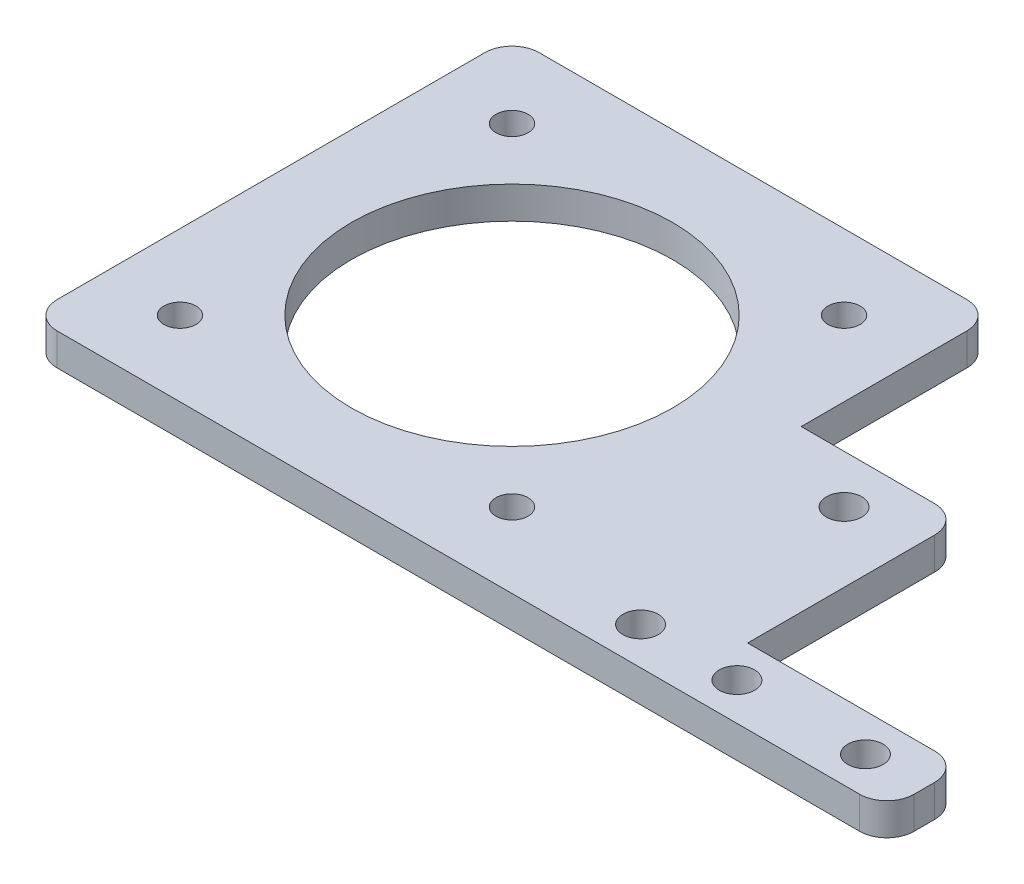
ISO-10303-21;
HEADER;
FILE_DESCRIPTION(('STEP AP214'),'2;1');
FILE_NAME('part.step','',(''),(''),'','','');
FILE_SCHEMA(('AUTOMOTIVE_DESIGN { 1 0 10303 214 1 1 1 1 }'));
ENDSEC;
DATA;
#1=APPLICATION_CONTEXT('core data for automotive mechanical design processes');
#2=APPLICATION_PROTOCOL_DEFINITION('international standard','automotive_design',2000,#1);
#3=PRODUCT_CONTEXT('',#1,'mechanical');
#4=PRODUCT('Part','Part','',(#3));
#5=PRODUCT_RELATED_PRODUCT_CATEGORY('part','',(#4));
#6=PRODUCT_DEFINITION_FORMATION('','',#4);
#7=PRODUCT_DEFINITION_CONTEXT('part definition',#1,'design');
#8=PRODUCT_DEFINITION('design','',#6,#7);
#9=PRODUCT_DEFINITION_SHAPE('','',#8);
#10=(LENGTH_UNIT() NAMED_UNIT(*) SI_UNIT(.MILLI.,.METRE.));
#11=(NAMED_UNIT(*) PLANE_ANGLE_UNIT() SI_UNIT($,.RADIAN.));
#12=(NAMED_UNIT(*) SI_UNIT($,.STERADIAN.) SOLID_ANGLE_UNIT());
#13=UNCERTAINTY_MEASURE_WITH_UNIT(LENGTH_MEASURE(1.E-05),#10,'distance_accuracy_value','');
#14=(GEOMETRIC_REPRESENTATION_CONTEXT(3) GLOBAL_UNCERTAINTY_ASSIGNED_CONTEXT((#13)) GLOBAL_UNIT_ASSIGNED_CONTEXT((#10,
#11,#12)) REPRESENTATION_CONTEXT('',''));
#15=CARTESIAN_POINT('',(0.,0.,0.));
#16=DIRECTION('',(0.,0.,1.));
#17=DIRECTION('',(1.,0.,0.));
#18=AXIS2_PLACEMENT_3D('',#15,#16,#17);
#19=CARTESIAN_POINT('',(0.,3.,0.));
#20=DIRECTION('',(0.,-1.,0.));
#21=DIRECTION('',(0.,0.,-1.));
#22=AXIS2_PLACEMENT_3D('',#19,#20,#21);
#23=PLANE('',#22);
#24=DIRECTION('',(0.,0.,1.));
#25=VECTOR('',#24,1.);
#26=CARTESIAN_POINT('',(-22.5,3.,22.5));
#27=LINE('',#26,#25);
#28=CARTESIAN_POINT('',(-22.5,3.,-19.96));
#29=VERTEX_POINT('',#28);
#30=CARTESIAN_POINT('',(-22.5,3.,19.96));
#31=VERTEX_POINT('',#30);
#32=EDGE_CURVE('E258',#29,#31,#27,.T.);
#33=ORIENTED_EDGE('',*,*,#32,.T.);
#34=CARTESIAN_POINT('',(-19.96,3.,19.96));
#35=DIRECTION('',(0.,-1.,0.));
#36=DIRECTION('',(0.,0.,-1.));
#37=AXIS2_PLACEMENT_3D('',#34,#35,#36);
#38=CIRCLE('',#37,2.54);
#39=CARTESIAN_POINT('',(-19.96,3.,22.5));
#40=VERTEX_POINT('',#39);
#41=EDGE_CURVE('E220',#31,#40,#38,.F.);
#42=ORIENTED_EDGE('',*,*,#41,.T.);
#43=DIRECTION('',(1.,0.,0.));
#44=VECTOR('',#43,1.);
#45=CARTESIAN_POINT('',(-22.5,3.,22.5));
#46=LINE('',#45,#44);
#47=CARTESIAN_POINT('',(54.96,3.,22.5));
#48=VERTEX_POINT('',#47);
#49=EDGE_CURVE('E260',#40,#48,#46,.T.);
#50=ORIENTED_EDGE('',*,*,#49,.T.);
#51=CARTESIAN_POINT('',(54.96,3.,19.96));
#52=DIRECTION('',(0.,-1.,0.));
#53=DIRECTION('',(0.,0.,-1.));
#54=AXIS2_PLACEMENT_3D('',#51,#52,#53);
#55=CIRCLE('',#54,2.54);
#56=CARTESIAN_POINT('',(57.5,3.,19.96));
#57=VERTEX_POINT('',#56);
#58=EDGE_CURVE('E218',#48,#57,#55,.F.);
#59=ORIENTED_EDGE('',*,*,#58,.T.);
#60=DIRECTION('',(0.,0.,-1.));
#61=VECTOR('',#60,1.);
#62=CARTESIAN_POINT('',(57.5,3.,22.5));
#63=LINE('',#62,#61);
#64=CARTESIAN_POINT('',(57.5,3.,18.04));
#65=VERTEX_POINT('',#64);
#66=EDGE_CURVE('E150',#57,#65,#63,.T.);
#67=ORIENTED_EDGE('',*,*,#66,.T.);
#68=CARTESIAN_POINT('',(54.96,3.,18.04));
#69=DIRECTION('',(0.,-1.,0.));
#70=DIRECTION('',(0.,0.,-1.));
#71=AXIS2_PLACEMENT_3D('',#68,#69,#70);
#72=CIRCLE('',#71,2.54);
#73=CARTESIAN_POINT('',(54.96,3.,15.5));
#74=VERTEX_POINT('',#73);
#75=EDGE_CURVE('E146',#65,#74,#72,.F.);
#76=ORIENTED_EDGE('',*,*,#75,.T.);
#77=DIRECTION('',(-1.,0.,0.));
#78=VECTOR('',#77,1.);
#79=CARTESIAN_POINT('',(57.5,3.,15.5));
#80=LINE('',#79,#78);
#81=CARTESIAN_POINT('',(37.5,3.,15.5));
#82=VERTEX_POINT('',#81);
#83=EDGE_CURVE('E139',#74,#82,#80,.T.);
#84=ORIENTED_EDGE('',*,*,#83,.T.);
#85=DIRECTION('',(0.,0.,-1.));
#86=VECTOR('',#85,1.);
#87=CARTESIAN_POINT('',(37.5,3.,15.5));
#88=LINE('',#87,#86);
#89=CARTESIAN_POINT('',(37.5,3.,-1.96000000000001));
#90=VERTEX_POINT('',#89);
#91=EDGE_CURVE('E143',#82,#90,#88,.T.);
#92=ORIENTED_EDGE('',*,*,#91,.T.);
#93=CARTESIAN_POINT('',(34.96,3.,-1.96000000000001));
#94=DIRECTION('',(0.,-1.,0.));
#95=DIRECTION('',(0.,0.,-1.));
#96=AXIS2_PLACEMENT_3D('',#93,#94,#95);
#97=CIRCLE('',#96,2.54);
#98=CARTESIAN_POINT('',(34.96,3.,-4.50000000000001));
#99=VERTEX_POINT('',#98);
#100=EDGE_CURVE('E54',#90,#99,#97,.F.);
#101=ORIENTED_EDGE('',*,*,#100,.T.);
#102=DIRECTION('',(-1.,0.,0.));
#103=VECTOR('',#102,1.);
#104=CARTESIAN_POINT('',(37.5,3.,-4.50000000000001));
#105=LINE('',#104,#103);
#106=CARTESIAN_POINT('',(22.5,3.,-4.50000000000001));
#107=VERTEX_POINT('',#106);
#108=EDGE_CURVE('E162',#99,#107,#105,.T.);
#109=ORIENTED_EDGE('',*,*,#108,.T.);
#110=DIRECTION('',(0.,0.,-1.));
#111=VECTOR('',#110,1.);
#112=CARTESIAN_POINT('',(22.5,3.,-4.50000000000001));
#113=LINE('',#112,#111);
#114=CARTESIAN_POINT('',(22.5,3.,-19.96));
#115=VERTEX_POINT('',#114);
#116=EDGE_CURVE('E188',#107,#115,#113,.T.);
#117=ORIENTED_EDGE('',*,*,#116,.T.);
#118=CARTESIAN_POINT('',(19.96,3.,-19.96));
#119=DIRECTION('',(0.,-1.,0.));
#120=DIRECTION('',(0.,0.,-1.));
#121=AXIS2_PLACEMENT_3D('',#118,#119,#120);
#122=CIRCLE('',#121,2.54);
#123=CARTESIAN_POINT('',(19.96,3.,-22.5));
#124=VERTEX_POINT('',#123);
#125=EDGE_CURVE('E214',#115,#124,#122,.F.);
#126=ORIENTED_EDGE('',*,*,#125,.T.);
#127=DIRECTION('',(-1.,0.,0.));
#128=VECTOR('',#127,1.);
#129=CARTESIAN_POINT('',(-22.5,3.,-22.5));
#130=LINE('',#129,#128);
#131=CARTESIAN_POINT('',(-19.96,3.,-22.5));
#132=VERTEX_POINT('',#131);
#133=EDGE_CURVE('E242',#124,#132,#130,.T.);
#134=ORIENTED_EDGE('',*,*,#133,.T.);
#135=CARTESIAN_POINT('',(-19.96,3.,-19.96));
#136=DIRECTION('',(0.,-1.,0.));
#137=DIRECTION('',(0.,0.,-1.));
#138=AXIS2_PLACEMENT_3D('',#135,#136,#137);
#139=CIRCLE('',#138,2.54);
#140=EDGE_CURVE('E212',#132,#29,#139,.F.);
#141=ORIENTED_EDGE('',*,*,#140,.T.);
#142=EDGE_LOOP('',(#33,#42,#50,#59,#67,#76,#84,#92,#101,#109,#117,#126,#134,#141));
#143=FACE_BOUND('',#142,.T.);
#144=CARTESIAN_POINT('',(0.,3.,0.));
#145=DIRECTION('',(0.,1.,0.));
#146=DIRECTION('',(0.,0.,1.));
#147=AXIS2_PLACEMENT_3D('',#144,#145,#146);
#148=CIRCLE('',#147,15.);
#149=CARTESIAN_POINT('',(0.,3.,15.));
#150=VERTEX_POINT('',#149);
#151=EDGE_CURVE('E171',#150,#150,#148,.T.);
#152=ORIENTED_EDGE('',*,*,#151,.F.);
#153=EDGE_LOOP('',(#152));
#154=FACE_BOUND('',#153,.T.);
#155=CARTESIAN_POINT('',(31.,3.,0.));
#156=DIRECTION('',(0.,1.,0.));
#157=DIRECTION('',(0.,0.,1.));
#158=AXIS2_PLACEMENT_3D('',#155,#156,#157);
#159=CIRCLE('',#158,1.65);
#160=CARTESIAN_POINT('',(31.,3.,1.65));
#161=VERTEX_POINT('',#160);
#162=EDGE_CURVE('E291',#161,#161,#159,.T.);
#163=ORIENTED_EDGE('',*,*,#162,.F.);
#164=EDGE_LOOP('',(#163));
#165=FACE_BOUND('',#164,.T.);
#166=CARTESIAN_POINT('',(15.5,3.,-15.5));
#167=DIRECTION('',(0.,1.,0.));
#168=DIRECTION('',(0.,0.,1.));
#169=AXIS2_PLACEMENT_3D('',#166,#167,#168);
#170=CIRCLE('',#169,1.5);
#171=CARTESIAN_POINT('',(15.5,3.,-14.));
#172=VERTEX_POINT('',#171);
#173=EDGE_CURVE('E297',#172,#172,#170,.T.);
#174=ORIENTED_EDGE('',*,*,#173,.F.);
#175=EDGE_LOOP('',(#174));
#176=FACE_BOUND('',#175,.T.);
#177=CARTESIAN_POINT('',(31.,3.,19.));
#178=DIRECTION('',(0.,1.,0.));
#179=DIRECTION('',(0.,0.,1.));
#180=AXIS2_PLACEMENT_3D('',#177,#178,#179);
#181=CIRCLE('',#180,1.65);
#182=CARTESIAN_POINT('',(31.,3.,20.65));
#183=VERTEX_POINT('',#182);
#184=EDGE_CURVE('E303',#183,#183,#181,.T.);
#185=ORIENTED_EDGE('',*,*,#184,.F.);
#186=EDGE_LOOP('',(#185));
#187=FACE_BOUND('',#186,.T.);
#188=CARTESIAN_POINT('',(40.,3.,19.));
#189=DIRECTION('',(0.,1.,0.));
#190=DIRECTION('',(0.,0.,1.));
#191=AXIS2_PLACEMENT_3D('',#188,#189,#190);
#192=CIRCLE('',#191,1.65);
#193=CARTESIAN_POINT('',(40.,3.,20.65));
#194=VERTEX_POINT('',#193);
#195=EDGE_CURVE('E309',#194,#194,#192,.T.);
#196=ORIENTED_EDGE('',*,*,#195,.F.);
#197=EDGE_LOOP('',(#196));
#198=FACE_BOUND('',#197,.T.);
#199=CARTESIAN_POINT('',(15.4999999999999,3.,15.5000000000001));
#200=DIRECTION('',(0.,1.,0.));
#201=DIRECTION('',(0.,0.,1.));
#202=AXIS2_PLACEMENT_3D('',#199,#200,#201);
#203=CIRCLE('',#202,1.5);
#204=CARTESIAN_POINT('',(15.4999999999999,3.,17.0000000000001));
#205=VERTEX_POINT('',#204);
#206=EDGE_CURVE('E315',#205,#205,#203,.T.);
#207=ORIENTED_EDGE('',*,*,#206,.F.);
#208=EDGE_LOOP('',(#207));
#209=FACE_BOUND('',#208,.T.);
#210=CARTESIAN_POINT('',(-15.5000000000001,3.,15.4999999999999));
#211=DIRECTION('',(0.,1.,0.));
#212=DIRECTION('',(0.,0.,1.));
#213=AXIS2_PLACEMENT_3D('',#210,#211,#212);
#214=CIRCLE('',#213,1.5);
#215=CARTESIAN_POINT('',(-15.5000000000001,3.,16.9999999999999));
#216=VERTEX_POINT('',#215);
#217=EDGE_CURVE('E321',#216,#216,#214,.T.);
#218=ORIENTED_EDGE('',*,*,#217,.F.);
#219=EDGE_LOOP('',(#218));
#220=FACE_BOUND('',#219,.T.);
#221=CARTESIAN_POINT('',(-15.4999999999998,3.,-15.5000000000002));
#222=DIRECTION('',(0.,1.,0.));
#223=DIRECTION('',(0.,0.,1.));
#224=AXIS2_PLACEMENT_3D('',#221,#222,#223);
#225=CIRCLE('',#224,1.5);
#226=CARTESIAN_POINT('',(-15.4999999999998,3.,-14.0000000000002));
#227=VERTEX_POINT('',#226);
#228=EDGE_CURVE('E327',#227,#227,#225,.T.);
#229=ORIENTED_EDGE('',*,*,#228,.F.);
#230=EDGE_LOOP('',(#229));
#231=FACE_BOUND('',#230,.T.);
#232=CARTESIAN_POINT('',(52.,3.,19.));
#233=DIRECTION('',(0.,1.,0.));
#234=DIRECTION('',(0.,0.,1.));
#235=AXIS2_PLACEMENT_3D('',#232,#233,#234);
#236=CIRCLE('',#235,1.65);
#237=CARTESIAN_POINT('',(52.,3.,20.65));
#238=VERTEX_POINT('',#237);
#239=EDGE_CURVE('E333',#238,#238,#236,.T.);
#240=ORIENTED_EDGE('',*,*,#239,.F.);
#241=EDGE_LOOP('',(#240));
#242=FACE_BOUND('',#241,.T.);
#243=ADVANCED_FACE('F39',(#143,#154,#165,#176,#187,#198,#209,#220,#231,#242),#23,.F.);
#244=CARTESIAN_POINT('',(0.,0.,0.));
#245=DIRECTION('',(0.,-1.,0.));
#246=DIRECTION('',(0.,0.,-1.));
#247=AXIS2_PLACEMENT_3D('',#244,#245,#246);
#248=PLANE('',#247);
#249=CARTESIAN_POINT('',(-15.4999999999998,0.,-15.5000000000002));
#250=DIRECTION('',(0.,1.,0.));
#251=DIRECTION('',(0.,0.,1.));
#252=AXIS2_PLACEMENT_3D('',#249,#250,#251);
#253=CIRCLE('',#252,1.5);
#254=CARTESIAN_POINT('',(-15.4999999999998,0.,-14.0000000000002));
#255=VERTEX_POINT('',#254);
#256=EDGE_CURVE('E330',#255,#255,#253,.T.);
#257=ORIENTED_EDGE('',*,*,#256,.T.);
#258=EDGE_LOOP('',(#257));
#259=FACE_BOUND('',#258,.T.);
#260=CARTESIAN_POINT('',(15.4999999999999,0.,15.5000000000001));
#261=DIRECTION('',(0.,1.,0.));
#262=DIRECTION('',(0.,0.,1.));
#263=AXIS2_PLACEMENT_3D('',#260,#261,#262);
#264=CIRCLE('',#263,1.5);
#265=CARTESIAN_POINT('',(15.4999999999999,0.,17.0000000000001));
#266=VERTEX_POINT('',#265);
#267=EDGE_CURVE('E318',#266,#266,#264,.T.);
#268=ORIENTED_EDGE('',*,*,#267,.T.);
#269=EDGE_LOOP('',(#268));
#270=FACE_BOUND('',#269,.T.);
#271=CARTESIAN_POINT('',(31.,0.,19.));
#272=DIRECTION('',(0.,1.,0.));
#273=DIRECTION('',(0.,0.,1.));
#274=AXIS2_PLACEMENT_3D('',#271,#272,#273);
#275=CIRCLE('',#274,1.65);
#276=CARTESIAN_POINT('',(31.,0.,20.65));
#277=VERTEX_POINT('',#276);
#278=EDGE_CURVE('E306',#277,#277,#275,.T.);
#279=ORIENTED_EDGE('',*,*,#278,.T.);
#280=EDGE_LOOP('',(#279));
#281=FACE_BOUND('',#280,.T.);
#282=CARTESIAN_POINT('',(31.,0.,0.));
#283=DIRECTION('',(0.,1.,0.));
#284=DIRECTION('',(0.,0.,1.));
#285=AXIS2_PLACEMENT_3D('',#282,#283,#284);
#286=CIRCLE('',#285,1.65);
#287=CARTESIAN_POINT('',(31.,0.,1.65));
#288=VERTEX_POINT('',#287);
#289=EDGE_CURVE('E294',#288,#288,#286,.T.);
#290=ORIENTED_EDGE('',*,*,#289,.T.);
#291=EDGE_LOOP('',(#290));
#292=FACE_BOUND('',#291,.T.);
#293=DIRECTION('',(1.,0.,0.));
#294=VECTOR('',#293,1.);
#295=CARTESIAN_POINT('',(22.5,0.,22.5));
#296=LINE('',#295,#294);
#297=CARTESIAN_POINT('',(-19.96,0.,22.5));
#298=VERTEX_POINT('',#297);
#299=CARTESIAN_POINT('',(54.96,0.,22.5));
#300=VERTEX_POINT('',#299);
#301=EDGE_CURVE('E177',#298,#300,#296,.T.);
#302=ORIENTED_EDGE('',*,*,#301,.F.);
#303=CARTESIAN_POINT('',(-19.96,0.,19.96));
#304=DIRECTION('',(0.,-1.,0.));
#305=DIRECTION('',(0.,0.,-1.));
#306=AXIS2_PLACEMENT_3D('',#303,#304,#305);
#307=CIRCLE('',#306,2.54);
#308=CARTESIAN_POINT('',(-22.5,0.,19.96));
#309=VERTEX_POINT('',#308);
#310=EDGE_CURVE('E205',#298,#309,#307,.T.);
#311=ORIENTED_EDGE('',*,*,#310,.T.);
#312=DIRECTION('',(0.,0.,1.));
#313=VECTOR('',#312,1.);
#314=CARTESIAN_POINT('',(-22.5,0.,22.5));
#315=LINE('',#314,#313);
#316=CARTESIAN_POINT('',(-22.5,0.,-19.96));
#317=VERTEX_POINT('',#316);
#318=EDGE_CURVE('E174',#317,#309,#315,.T.);
#319=ORIENTED_EDGE('',*,*,#318,.F.);
#320=CARTESIAN_POINT('',(-19.96,0.,-19.96));
#321=DIRECTION('',(0.,-1.,0.));
#322=DIRECTION('',(0.,0.,-1.));
#323=AXIS2_PLACEMENT_3D('',#320,#321,#322);
#324=CIRCLE('',#323,2.54);
#325=CARTESIAN_POINT('',(-19.96,0.,-22.5));
#326=VERTEX_POINT('',#325);
#327=EDGE_CURVE('E195',#317,#326,#324,.T.);
#328=ORIENTED_EDGE('',*,*,#327,.T.);
#329=DIRECTION('',(-1.,0.,0.));
#330=VECTOR('',#329,1.);
#331=CARTESIAN_POINT('',(-22.5,0.,-22.5));
#332=LINE('',#331,#330);
#333=CARTESIAN_POINT('',(19.96,0.,-22.5));
#334=VERTEX_POINT('',#333);
#335=EDGE_CURVE('E170',#334,#326,#332,.T.);
#336=ORIENTED_EDGE('',*,*,#335,.F.);
#337=CARTESIAN_POINT('',(19.96,0.,-19.96));
#338=DIRECTION('',(0.,-1.,0.));
#339=DIRECTION('',(0.,0.,-1.));
#340=AXIS2_PLACEMENT_3D('',#337,#338,#339);
#341=CIRCLE('',#340,2.54);
#342=CARTESIAN_POINT('',(22.5,0.,-19.96));
#343=VERTEX_POINT('',#342);
#344=EDGE_CURVE('E197',#334,#343,#341,.T.);
#345=ORIENTED_EDGE('',*,*,#344,.T.);
#346=DIRECTION('',(0.,0.,-1.));
#347=VECTOR('',#346,1.);
#348=CARTESIAN_POINT('',(22.5,0.,-4.50000000000001));
#349=LINE('',#348,#347);
#350=CARTESIAN_POINT('',(22.5,0.,-4.50000000000001));
#351=VERTEX_POINT('',#350);
#352=EDGE_CURVE('E167',#351,#343,#349,.T.);
#353=ORIENTED_EDGE('',*,*,#352,.F.);
#354=DIRECTION('',(-1.,0.,0.));
#355=VECTOR('',#354,1.);
#356=CARTESIAN_POINT('',(37.5,0.,-4.50000000000001));
#357=LINE('',#356,#355);
#358=CARTESIAN_POINT('',(34.96,0.,-4.50000000000001));
#359=VERTEX_POINT('',#358);
#360=EDGE_CURVE('E186',#359,#351,#357,.T.);
#361=ORIENTED_EDGE('',*,*,#360,.F.);
#362=CARTESIAN_POINT('',(34.96,0.,-1.96000000000001));
#363=DIRECTION('',(0.,-1.,0.));
#364=DIRECTION('',(0.,0.,-1.));
#365=AXIS2_PLACEMENT_3D('',#362,#363,#364);
#366=CIRCLE('',#365,2.54);
#367=CARTESIAN_POINT('',(37.5,0.,-1.96000000000001));
#368=VERTEX_POINT('',#367);
#369=EDGE_CURVE('E199',#359,#368,#366,.T.);
#370=ORIENTED_EDGE('',*,*,#369,.T.);
#371=DIRECTION('',(0.,0.,-1.));
#372=VECTOR('',#371,1.);
#373=CARTESIAN_POINT('',(37.5,0.,15.5));
#374=LINE('',#373,#372);
#375=CARTESIAN_POINT('',(37.5,0.,15.5));
#376=VERTEX_POINT('',#375);
#377=EDGE_CURVE('E184',#376,#368,#374,.T.);
#378=ORIENTED_EDGE('',*,*,#377,.F.);
#379=DIRECTION('',(-1.,0.,0.));
#380=VECTOR('',#379,1.);
#381=CARTESIAN_POINT('',(57.5,0.,15.5));
#382=LINE('',#381,#380);
#383=CARTESIAN_POINT('',(54.96,0.,15.5));
#384=VERTEX_POINT('',#383);
#385=EDGE_CURVE('E156',#384,#376,#382,.T.);
#386=ORIENTED_EDGE('',*,*,#385,.F.);
#387=CARTESIAN_POINT('',(54.96,0.,18.04));
#388=DIRECTION('',(0.,-1.,0.));
#389=DIRECTION('',(0.,0.,-1.));
#390=AXIS2_PLACEMENT_3D('',#387,#388,#389);
#391=CIRCLE('',#390,2.54);
#392=CARTESIAN_POINT('',(57.5,0.,18.04));
#393=VERTEX_POINT('',#392);
#394=EDGE_CURVE('E201',#384,#393,#391,.T.);
#395=ORIENTED_EDGE('',*,*,#394,.T.);
#396=DIRECTION('',(0.,0.,-1.));
#397=VECTOR('',#396,1.);
#398=CARTESIAN_POINT('',(57.5,0.,22.5));
#399=LINE('',#398,#397);
#400=CARTESIAN_POINT('',(57.5,0.,19.96));
#401=VERTEX_POINT('',#400);
#402=EDGE_CURVE('E180',#401,#393,#399,.T.);
#403=ORIENTED_EDGE('',*,*,#402,.F.);
#404=CARTESIAN_POINT('',(54.96,0.,19.96));
#405=DIRECTION('',(0.,-1.,0.));
#406=DIRECTION('',(0.,0.,-1.));
#407=AXIS2_PLACEMENT_3D('',#404,#405,#406);
#408=CIRCLE('',#407,2.54);
#409=EDGE_CURVE('E203',#401,#300,#408,.T.);
#410=ORIENTED_EDGE('',*,*,#409,.T.);
#411=EDGE_LOOP('',(#302,#311,#319,#328,#336,#345,#353,#361,#370,#378,#386,#395,#403,#410));
#412=FACE_BOUND('',#411,.T.);
#413=CARTESIAN_POINT('',(0.,0.,0.));
#414=DIRECTION('',(0.,1.,0.));
#415=DIRECTION('',(0.,0.,1.));
#416=AXIS2_PLACEMENT_3D('',#413,#414,#415);
#417=CIRCLE('',#416,15.);
#418=CARTESIAN_POINT('',(0.,0.,15.));
#419=VERTEX_POINT('',#418);
#420=EDGE_CURVE('E288',#419,#419,#417,.T.);
#421=ORIENTED_EDGE('',*,*,#420,.T.);
#422=EDGE_LOOP('',(#421));
#423=FACE_BOUND('',#422,.T.);
#424=CARTESIAN_POINT('',(15.5,0.,-15.5));
#425=DIRECTION('',(0.,1.,0.));
#426=DIRECTION('',(0.,0.,1.));
#427=AXIS2_PLACEMENT_3D('',#424,#425,#426);
#428=CIRCLE('',#427,1.5);
#429=CARTESIAN_POINT('',(15.5,0.,-14.));
#430=VERTEX_POINT('',#429);
#431=EDGE_CURVE('E300',#430,#430,#428,.T.);
#432=ORIENTED_EDGE('',*,*,#431,.T.);
#433=EDGE_LOOP('',(#432));
#434=FACE_BOUND('',#433,.T.);
#435=CARTESIAN_POINT('',(40.,0.,19.));
#436=DIRECTION('',(0.,1.,0.));
#437=DIRECTION('',(0.,0.,1.));
#438=AXIS2_PLACEMENT_3D('',#435,#436,#437);
#439=CIRCLE('',#438,1.65);
#440=CARTESIAN_POINT('',(40.,0.,20.65));
#441=VERTEX_POINT('',#440);
#442=EDGE_CURVE('E312',#441,#441,#439,.T.);
#443=ORIENTED_EDGE('',*,*,#442,.T.);
#444=EDGE_LOOP('',(#443));
#445=FACE_BOUND('',#444,.T.);
#446=CARTESIAN_POINT('',(-15.5000000000001,0.,15.4999999999999));
#447=DIRECTION('',(0.,1.,0.));
#448=DIRECTION('',(0.,0.,1.));
#449=AXIS2_PLACEMENT_3D('',#446,#447,#448);
#450=CIRCLE('',#449,1.5);
#451=CARTESIAN_POINT('',(-15.5000000000001,0.,16.9999999999999));
#452=VERTEX_POINT('',#451);
#453=EDGE_CURVE('E324',#452,#452,#450,.T.);
#454=ORIENTED_EDGE('',*,*,#453,.T.);
#455=EDGE_LOOP('',(#454));
#456=FACE_BOUND('',#455,.T.);
#457=CARTESIAN_POINT('',(52.,0.,19.));
#458=DIRECTION('',(0.,1.,0.));
#459=DIRECTION('',(0.,0.,1.));
#460=AXIS2_PLACEMENT_3D('',#457,#458,#459);
#461=CIRCLE('',#460,1.65);
#462=CARTESIAN_POINT('',(52.,0.,20.65));
#463=VERTEX_POINT('',#462);
#464=EDGE_CURVE('E336',#463,#463,#461,.T.);
#465=ORIENTED_EDGE('',*,*,#464,.T.);
#466=EDGE_LOOP('',(#465));
#467=FACE_BOUND('',#466,.T.);
#468=ADVANCED_FACE('F247',(#259,#270,#281,#292,#412,#423,#434,#445,#456,#467),#248,.T.);
#469=CARTESIAN_POINT('',(22.5,3.,-4.50000000000001));
#470=DIRECTION('',(-1.,0.,0.));
#471=DIRECTION('',(0.,0.,1.));
#472=AXIS2_PLACEMENT_3D('',#469,#470,#471);
#473=PLANE('',#472);
#474=ORIENTED_EDGE('',*,*,#352,.T.);
#475=DIRECTION('',(0.,-1.,0.));
#476=VECTOR('',#475,1.);
#477=CARTESIAN_POINT('',(22.5,3.,-19.96));
#478=LINE('',#477,#476);
#479=EDGE_CURVE('E11',#343,#115,#478,.F.);
#480=ORIENTED_EDGE('',*,*,#479,.T.);
#481=ORIENTED_EDGE('',*,*,#116,.F.);
#482=DIRECTION('',(0.,-1.,0.));
#483=VECTOR('',#482,1.);
#484=CARTESIAN_POINT('',(22.5,3.,-4.50000000000001));
#485=LINE('',#484,#483);
#486=EDGE_CURVE('E159',#107,#351,#485,.T.);
#487=ORIENTED_EDGE('',*,*,#486,.T.);
#488=EDGE_LOOP('',(#474,#480,#481,#487));
#489=FACE_BOUND('',#488,.T.);
#490=ADVANCED_FACE('F283',(#489),#473,.F.);
#491=CARTESIAN_POINT('',(-22.5,3.,-22.5));
#492=DIRECTION('',(0.,0.,1.));
#493=DIRECTION('',(1.,0.,0.));
#494=AXIS2_PLACEMENT_3D('',#491,#492,#493);
#495=PLANE('',#494);
#496=ORIENTED_EDGE('',*,*,#133,.F.);
#497=DIRECTION('',(0.,-1.,0.));
#498=VECTOR('',#497,1.);
#499=CARTESIAN_POINT('',(19.96,3.,-22.5));
#500=LINE('',#499,#498);
#501=EDGE_CURVE('E47',#124,#334,#500,.T.);
#502=ORIENTED_EDGE('',*,*,#501,.T.);
#503=ORIENTED_EDGE('',*,*,#335,.T.);
#504=DIRECTION('',(0.,-1.,0.));
#505=VECTOR('',#504,1.);
#506=CARTESIAN_POINT('',(-19.96,3.,-22.5));
#507=LINE('',#506,#505);
#508=EDGE_CURVE('E233',#326,#132,#507,.F.);
#509=ORIENTED_EDGE('',*,*,#508,.T.);
#510=EDGE_LOOP('',(#496,#502,#503,#509));
#511=FACE_BOUND('',#510,.T.);
#512=ADVANCED_FACE('F239',(#511),#495,.F.);
#513=CARTESIAN_POINT('',(-22.5,3.,22.5));
#514=DIRECTION('',(1.,0.,0.));
#515=DIRECTION('',(0.,0.,-1.));
#516=AXIS2_PLACEMENT_3D('',#513,#514,#515);
#517=PLANE('',#516);
#518=ORIENTED_EDGE('',*,*,#318,.T.);
#519=DIRECTION('',(0.,-1.,0.));
#520=VECTOR('',#519,1.);
#521=CARTESIAN_POINT('',(-22.5,3.,19.96));
#522=LINE('',#521,#520);
#523=EDGE_CURVE('E210',#309,#31,#522,.F.);
#524=ORIENTED_EDGE('',*,*,#523,.T.);
#525=ORIENTED_EDGE('',*,*,#32,.F.);
#526=DIRECTION('',(0.,-1.,0.));
#527=VECTOR('',#526,1.);
#528=CARTESIAN_POINT('',(-22.5,3.,-19.96));
#529=LINE('',#528,#527);
#530=EDGE_CURVE('E207',#29,#317,#529,.T.);
#531=ORIENTED_EDGE('',*,*,#530,.T.);
#532=EDGE_LOOP('',(#518,#524,#525,#531));
#533=FACE_BOUND('',#532,.T.);
#534=ADVANCED_FACE('F256',(#533),#517,.F.);
#535=CARTESIAN_POINT('',(22.5,3.,22.5));
#536=DIRECTION('',(0.,0.,-1.));
#537=DIRECTION('',(-1.,0.,0.));
#538=AXIS2_PLACEMENT_3D('',#535,#536,#537);
#539=PLANE('',#538);
#540=ORIENTED_EDGE('',*,*,#49,.F.);
#541=DIRECTION('',(0.,-1.,0.));
#542=VECTOR('',#541,1.);
#543=CARTESIAN_POINT('',(-19.96,3.,22.5));
#544=LINE('',#543,#542);
#545=EDGE_CURVE('E192',#40,#298,#544,.T.);
#546=ORIENTED_EDGE('',*,*,#545,.T.);
#547=ORIENTED_EDGE('',*,*,#301,.T.);
#548=DIRECTION('',(0.,-1.,0.));
#549=VECTOR('',#548,1.);
#550=CARTESIAN_POINT('',(54.96,3.,22.5));
#551=LINE('',#550,#549);
#552=EDGE_CURVE('E158',#300,#48,#551,.F.);
#553=ORIENTED_EDGE('',*,*,#552,.T.);
#554=EDGE_LOOP('',(#540,#546,#547,#553));
#555=FACE_BOUND('',#554,.T.);
#556=ADVANCED_FACE('F366',(#555),#539,.F.);
#557=CARTESIAN_POINT('',(57.5,3.,22.5));
#558=DIRECTION('',(-1.,0.,0.));
#559=DIRECTION('',(0.,0.,1.));
#560=AXIS2_PLACEMENT_3D('',#557,#558,#559);
#561=PLANE('',#560);
#562=ORIENTED_EDGE('',*,*,#66,.F.);
#563=DIRECTION('',(0.,-1.,0.));
#564=VECTOR('',#563,1.);
#565=CARTESIAN_POINT('',(57.5,3.,19.96));
#566=LINE('',#565,#564);
#567=EDGE_CURVE('E224',#57,#401,#566,.T.);
#568=ORIENTED_EDGE('',*,*,#567,.T.);
#569=ORIENTED_EDGE('',*,*,#402,.T.);
#570=DIRECTION('',(0.,-1.,0.));
#571=VECTOR('',#570,1.);
#572=CARTESIAN_POINT('',(57.5,3.,18.04));
#573=LINE('',#572,#571);
#574=EDGE_CURVE('E222',#393,#65,#573,.F.);
#575=ORIENTED_EDGE('',*,*,#574,.T.);
#576=EDGE_LOOP('',(#562,#568,#569,#575));
#577=FACE_BOUND('',#576,.T.);
#578=ADVANCED_FACE('F363',(#577),#561,.F.);
#579=CARTESIAN_POINT('',(57.5,3.,15.5));
#580=DIRECTION('',(0.,0.,1.));
#581=DIRECTION('',(1.,0.,0.));
#582=AXIS2_PLACEMENT_3D('',#579,#580,#581);
#583=PLANE('',#582);
#584=ORIENTED_EDGE('',*,*,#83,.F.);
#585=DIRECTION('',(0.,-1.,0.));
#586=VECTOR('',#585,1.);
#587=CARTESIAN_POINT('',(54.96,3.,15.5));
#588=LINE('',#587,#586);
#589=EDGE_CURVE('E227',#74,#384,#588,.T.);
#590=ORIENTED_EDGE('',*,*,#589,.T.);
#591=ORIENTED_EDGE('',*,*,#385,.T.);
#592=DIRECTION('',(0.,-1.,0.));
#593=VECTOR('',#592,1.);
#594=CARTESIAN_POINT('',(37.5,3.,15.5));
#595=LINE('',#594,#593);
#596=EDGE_CURVE('E153',#82,#376,#595,.T.);
#597=ORIENTED_EDGE('',*,*,#596,.F.);
#598=EDGE_LOOP('',(#584,#590,#591,#597));
#599=FACE_BOUND('',#598,.T.);
#600=ADVANCED_FACE('F154',(#599),#583,.F.);
#601=CARTESIAN_POINT('',(37.5,3.,15.5));
#602=DIRECTION('',(-1.,0.,0.));
#603=DIRECTION('',(0.,0.,1.));
#604=AXIS2_PLACEMENT_3D('',#601,#602,#603);
#605=PLANE('',#604);
#606=ORIENTED_EDGE('',*,*,#377,.T.);
#607=DIRECTION('',(0.,-1.,0.));
#608=VECTOR('',#607,1.);
#609=CARTESIAN_POINT('',(37.5,3.,-1.96000000000001));
#610=LINE('',#609,#608);
#611=EDGE_CURVE('E62',#368,#90,#610,.F.);
#612=ORIENTED_EDGE('',*,*,#611,.T.);
#613=ORIENTED_EDGE('',*,*,#91,.F.);
#614=ORIENTED_EDGE('',*,*,#596,.T.);
#615=EDGE_LOOP('',(#606,#612,#613,#614));
#616=FACE_BOUND('',#615,.T.);
#617=ADVANCED_FACE('F161',(#616),#605,.F.);
#618=CARTESIAN_POINT('',(37.5,3.,-4.50000000000001));
#619=DIRECTION('',(0.,0.,1.));
#620=DIRECTION('',(1.,0.,0.));
#621=AXIS2_PLACEMENT_3D('',#618,#619,#620);
#622=PLANE('',#621);
#623=ORIENTED_EDGE('',*,*,#108,.F.);
#624=DIRECTION('',(0.,-1.,0.));
#625=VECTOR('',#624,1.);
#626=CARTESIAN_POINT('',(34.96,3.,-4.50000000000001));
#627=LINE('',#626,#625);
#628=EDGE_CURVE('E229',#99,#359,#627,.T.);
#629=ORIENTED_EDGE('',*,*,#628,.T.);
#630=ORIENTED_EDGE('',*,*,#360,.T.);
#631=ORIENTED_EDGE('',*,*,#486,.F.);
#632=EDGE_LOOP('',(#623,#629,#630,#631));
#633=FACE_BOUND('',#632,.T.);
#634=ADVANCED_FACE('F279',(#633),#622,.F.);
#635=CARTESIAN_POINT('',(0.,3.,0.));
#636=DIRECTION('',(0.,-1.,0.));
#637=DIRECTION('',(0.,0.,-1.));
#638=AXIS2_PLACEMENT_3D('',#635,#636,#637);
#639=CYLINDRICAL_SURFACE('',#638,15.);
#640=ORIENTED_EDGE('',*,*,#151,.T.);
#641=EDGE_LOOP('',(#640));
#642=FACE_BOUND('',#641,.T.);
#643=ORIENTED_EDGE('',*,*,#420,.F.);
#644=EDGE_LOOP('',(#643));
#645=FACE_BOUND('',#644,.T.);
#646=ADVANCED_FACE('F354',(#642,#645),#639,.F.);
#647=CARTESIAN_POINT('',(31.,3.,0.));
#648=DIRECTION('',(0.,-1.,0.));
#649=DIRECTION('',(0.,0.,-1.));
#650=AXIS2_PLACEMENT_3D('',#647,#648,#649);
#651=CYLINDRICAL_SURFACE('',#650,1.65);
#652=ORIENTED_EDGE('',*,*,#162,.T.);
#653=EDGE_LOOP('',(#652));
#654=FACE_BOUND('',#653,.T.);
#655=ORIENTED_EDGE('',*,*,#289,.F.);
#656=EDGE_LOOP('',(#655));
#657=FACE_BOUND('',#656,.T.);
#658=ADVANCED_FACE('F489',(#654,#657),#651,.F.);
#659=CARTESIAN_POINT('',(15.5,3.,-15.5));
#660=DIRECTION('',(0.,-1.,0.));
#661=DIRECTION('',(0.,0.,-1.));
#662=AXIS2_PLACEMENT_3D('',#659,#660,#661);
#663=CYLINDRICAL_SURFACE('',#662,1.5);
#664=ORIENTED_EDGE('',*,*,#173,.T.);
#665=EDGE_LOOP('',(#664));
#666=FACE_BOUND('',#665,.T.);
#667=ORIENTED_EDGE('',*,*,#431,.F.);
#668=EDGE_LOOP('',(#667));
#669=FACE_BOUND('',#668,.T.);
#670=ADVANCED_FACE('F479',(#666,#669),#663,.F.);
#671=CARTESIAN_POINT('',(31.,3.,19.));
#672=DIRECTION('',(0.,-1.,0.));
#673=DIRECTION('',(0.,0.,-1.));
#674=AXIS2_PLACEMENT_3D('',#671,#672,#673);
#675=CYLINDRICAL_SURFACE('',#674,1.65);
#676=ORIENTED_EDGE('',*,*,#184,.T.);
#677=EDGE_LOOP('',(#676));
#678=FACE_BOUND('',#677,.T.);
#679=ORIENTED_EDGE('',*,*,#278,.F.);
#680=EDGE_LOOP('',(#679));
#681=FACE_BOUND('',#680,.T.);
#682=ADVANCED_FACE('F469',(#678,#681),#675,.F.);
#683=CARTESIAN_POINT('',(40.,3.,19.));
#684=DIRECTION('',(0.,-1.,0.));
#685=DIRECTION('',(0.,0.,-1.));
#686=AXIS2_PLACEMENT_3D('',#683,#684,#685);
#687=CYLINDRICAL_SURFACE('',#686,1.65);
#688=ORIENTED_EDGE('',*,*,#195,.T.);
#689=EDGE_LOOP('',(#688));
#690=FACE_BOUND('',#689,.T.);
#691=ORIENTED_EDGE('',*,*,#442,.F.);
#692=EDGE_LOOP('',(#691));
#693=FACE_BOUND('',#692,.T.);
#694=ADVANCED_FACE('F459',(#690,#693),#687,.F.);
#695=CARTESIAN_POINT('',(15.4999999999999,3.,15.5000000000001));
#696=DIRECTION('',(0.,-1.,0.));
#697=DIRECTION('',(0.,0.,-1.));
#698=AXIS2_PLACEMENT_3D('',#695,#696,#697);
#699=CYLINDRICAL_SURFACE('',#698,1.5);
#700=ORIENTED_EDGE('',*,*,#206,.T.);
#701=EDGE_LOOP('',(#700));
#702=FACE_BOUND('',#701,.T.);
#703=ORIENTED_EDGE('',*,*,#267,.F.);
#704=EDGE_LOOP('',(#703));
#705=FACE_BOUND('',#704,.T.);
#706=ADVANCED_FACE('F449',(#702,#705),#699,.F.);
#707=CARTESIAN_POINT('',(-15.5000000000001,3.,15.4999999999999));
#708=DIRECTION('',(0.,-1.,0.));
#709=DIRECTION('',(0.,0.,-1.));
#710=AXIS2_PLACEMENT_3D('',#707,#708,#709);
#711=CYLINDRICAL_SURFACE('',#710,1.5);
#712=ORIENTED_EDGE('',*,*,#217,.T.);
#713=EDGE_LOOP('',(#712));
#714=FACE_BOUND('',#713,.T.);
#715=ORIENTED_EDGE('',*,*,#453,.F.);
#716=EDGE_LOOP('',(#715));
#717=FACE_BOUND('',#716,.T.);
#718=ADVANCED_FACE('F439',(#714,#717),#711,.F.);
#719=CARTESIAN_POINT('',(-15.4999999999998,3.,-15.5000000000002));
#720=DIRECTION('',(0.,-1.,0.));
#721=DIRECTION('',(0.,0.,-1.));
#722=AXIS2_PLACEMENT_3D('',#719,#720,#721);
#723=CYLINDRICAL_SURFACE('',#722,1.5);
#724=ORIENTED_EDGE('',*,*,#228,.T.);
#725=EDGE_LOOP('',(#724));
#726=FACE_BOUND('',#725,.T.);
#727=ORIENTED_EDGE('',*,*,#256,.F.);
#728=EDGE_LOOP('',(#727));
#729=FACE_BOUND('',#728,.T.);
#730=ADVANCED_FACE('F430',(#726,#729),#723,.F.);
#731=CARTESIAN_POINT('',(52.,3.,19.));
#732=DIRECTION('',(0.,-1.,0.));
#733=DIRECTION('',(0.,0.,-1.));
#734=AXIS2_PLACEMENT_3D('',#731,#732,#733);
#735=CYLINDRICAL_SURFACE('',#734,1.65);
#736=ORIENTED_EDGE('',*,*,#239,.T.);
#737=EDGE_LOOP('',(#736));
#738=FACE_BOUND('',#737,.T.);
#739=ORIENTED_EDGE('',*,*,#464,.F.);
#740=EDGE_LOOP('',(#739));
#741=FACE_BOUND('',#740,.T.);
#742=ADVANCED_FACE('F342',(#738,#741),#735,.F.);
#743=CARTESIAN_POINT('',(-19.96,3.,19.96));
#744=DIRECTION('',(0.,-1.,0.));
#745=DIRECTION('',(0.,0.,-1.));
#746=AXIS2_PLACEMENT_3D('',#743,#744,#745);
#747=CYLINDRICAL_SURFACE('',#746,2.54);
#748=ORIENTED_EDGE('',*,*,#41,.F.);
#749=ORIENTED_EDGE('',*,*,#523,.F.);
#750=ORIENTED_EDGE('',*,*,#310,.F.);
#751=ORIENTED_EDGE('',*,*,#545,.F.);
#752=EDGE_LOOP('',(#748,#749,#750,#751));
#753=FACE_BOUND('',#752,.T.);
#754=ADVANCED_FACE('F376',(#753),#747,.T.);
#755=CARTESIAN_POINT('',(54.96,3.,19.96));
#756=DIRECTION('',(0.,-1.,0.));
#757=DIRECTION('',(0.,0.,-1.));
#758=AXIS2_PLACEMENT_3D('',#755,#756,#757);
#759=CYLINDRICAL_SURFACE('',#758,2.54);
#760=ORIENTED_EDGE('',*,*,#58,.F.);
#761=ORIENTED_EDGE('',*,*,#552,.F.);
#762=ORIENTED_EDGE('',*,*,#409,.F.);
#763=ORIENTED_EDGE('',*,*,#567,.F.);
#764=EDGE_LOOP('',(#760,#761,#762,#763));
#765=FACE_BOUND('',#764,.T.);
#766=ADVANCED_FACE('F379',(#765),#759,.T.);
#767=CARTESIAN_POINT('',(54.96,3.,18.04));
#768=DIRECTION('',(0.,-1.,0.));
#769=DIRECTION('',(0.,0.,-1.));
#770=AXIS2_PLACEMENT_3D('',#767,#768,#769);
#771=CYLINDRICAL_SURFACE('',#770,2.54);
#772=ORIENTED_EDGE('',*,*,#75,.F.);
#773=ORIENTED_EDGE('',*,*,#574,.F.);
#774=ORIENTED_EDGE('',*,*,#394,.F.);
#775=ORIENTED_EDGE('',*,*,#589,.F.);
#776=EDGE_LOOP('',(#772,#773,#774,#775));
#777=FACE_BOUND('',#776,.T.);
#778=ADVANCED_FACE('F272',(#777),#771,.T.);
#779=CARTESIAN_POINT('',(34.96,3.,-1.96000000000001));
#780=DIRECTION('',(0.,-1.,0.));
#781=DIRECTION('',(0.,0.,-1.));
#782=AXIS2_PLACEMENT_3D('',#779,#780,#781);
#783=CYLINDRICAL_SURFACE('',#782,2.54);
#784=ORIENTED_EDGE('',*,*,#100,.F.);
#785=ORIENTED_EDGE('',*,*,#611,.F.);
#786=ORIENTED_EDGE('',*,*,#369,.F.);
#787=ORIENTED_EDGE('',*,*,#628,.F.);
#788=EDGE_LOOP('',(#784,#785,#786,#787));
#789=FACE_BOUND('',#788,.T.);
#790=ADVANCED_FACE('F276',(#789),#783,.T.);
#791=CARTESIAN_POINT('',(19.96,3.,-19.96));
#792=DIRECTION('',(0.,-1.,0.));
#793=DIRECTION('',(0.,0.,-1.));
#794=AXIS2_PLACEMENT_3D('',#791,#792,#793);
#795=CYLINDRICAL_SURFACE('',#794,2.54);
#796=ORIENTED_EDGE('',*,*,#125,.F.);
#797=ORIENTED_EDGE('',*,*,#479,.F.);
#798=ORIENTED_EDGE('',*,*,#344,.F.);
#799=ORIENTED_EDGE('',*,*,#501,.F.);
#800=EDGE_LOOP('',(#796,#797,#798,#799));
#801=FACE_BOUND('',#800,.T.);
#802=ADVANCED_FACE('F286',(#801),#795,.T.);
#803=CARTESIAN_POINT('',(-19.96,3.,-19.96));
#804=DIRECTION('',(0.,-1.,0.));
#805=DIRECTION('',(0.,0.,-1.));
#806=AXIS2_PLACEMENT_3D('',#803,#804,#805);
#807=CYLINDRICAL_SURFACE('',#806,2.54);
#808=ORIENTED_EDGE('',*,*,#140,.F.);
#809=ORIENTED_EDGE('',*,*,#508,.F.);
#810=ORIENTED_EDGE('',*,*,#327,.F.);
#811=ORIENTED_EDGE('',*,*,#530,.F.);
#812=EDGE_LOOP('',(#808,#809,#810,#811));
#813=FACE_BOUND('',#812,.T.);
#814=ADVANCED_FACE('F41',(#813),#807,.T.);
#815=CLOSED_SHELL('',(#243,#468,#490,#512,#534,#556,#578,#600,#617,#634,#646,#658,#670,#682,
#694,#706,#718,#730,#742,#754,#766,#778,#790,#802,#814));
#816=MANIFOLD_SOLID_BREP('B2',#815);
#817=ADVANCED_BREP_SHAPE_REPRESENTATION('',(#18,#816),#14);
#818=SHAPE_DEFINITION_REPRESENTATION(#9,#817);
ENDSEC;
END-ISO-10303-21;
